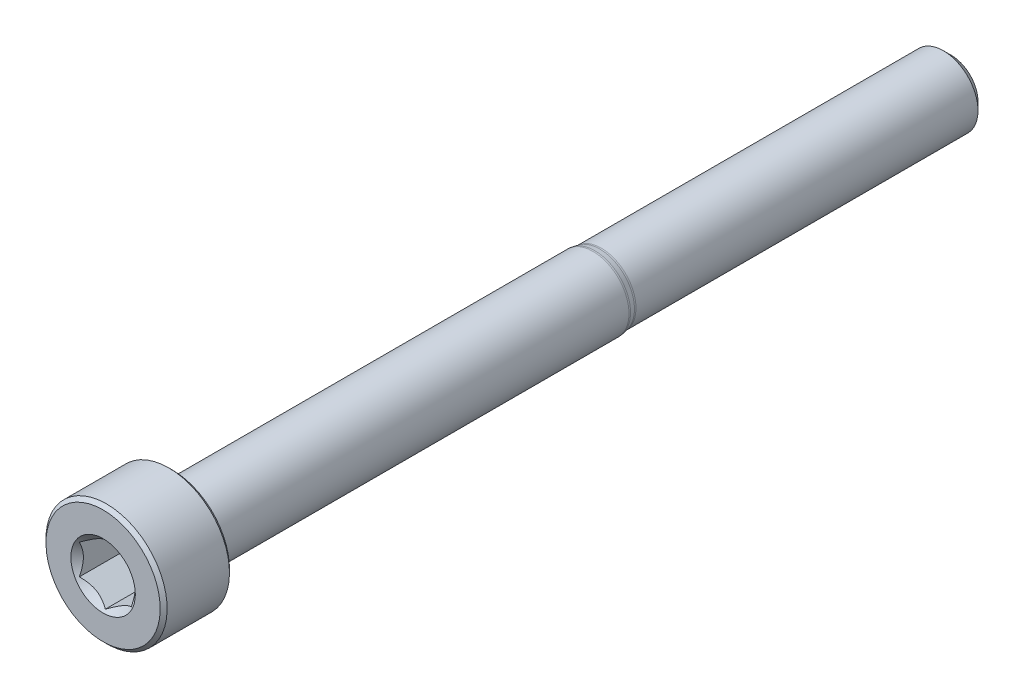
ISO-10303-21;
HEADER;
FILE_DESCRIPTION(('STEP AP214'),'2;1');
FILE_NAME('part.step','',(''),(''),'','','');
FILE_SCHEMA(('AUTOMOTIVE_DESIGN { 1 0 10303 214 1 1 1 1 }'));
ENDSEC;
DATA;
#1=APPLICATION_CONTEXT('core data for automotive mechanical design processes');
#2=APPLICATION_PROTOCOL_DEFINITION('international standard','automotive_design',2000,#1);
#3=PRODUCT_CONTEXT('',#1,'mechanical');
#4=PRODUCT('Part','Part','',(#3));
#5=PRODUCT_RELATED_PRODUCT_CATEGORY('part','',(#4));
#6=PRODUCT_DEFINITION_FORMATION('','',#4);
#7=PRODUCT_DEFINITION_CONTEXT('part definition',#1,'design');
#8=PRODUCT_DEFINITION('design','',#6,#7);
#9=PRODUCT_DEFINITION_SHAPE('','',#8);
#10=(LENGTH_UNIT() NAMED_UNIT(*) SI_UNIT(.MILLI.,.METRE.));
#11=(NAMED_UNIT(*) PLANE_ANGLE_UNIT() SI_UNIT($,.RADIAN.));
#12=(NAMED_UNIT(*) SI_UNIT($,.STERADIAN.) SOLID_ANGLE_UNIT());
#13=UNCERTAINTY_MEASURE_WITH_UNIT(LENGTH_MEASURE(1.E-05),#10,'distance_accuracy_value','');
#14=(GEOMETRIC_REPRESENTATION_CONTEXT(3) GLOBAL_UNCERTAINTY_ASSIGNED_CONTEXT((#13)) GLOBAL_UNIT_ASSIGNED_CONTEXT((#10,
#11,#12)) REPRESENTATION_CONTEXT('',''));
#15=CARTESIAN_POINT('',(0.,0.,0.));
#16=DIRECTION('',(0.,0.,1.));
#17=DIRECTION('',(1.,0.,0.));
#18=AXIS2_PLACEMENT_3D('',#15,#16,#17);
#19=CARTESIAN_POINT('',(0.,1.54533666301317,-24.5));
#20=DIRECTION('',(0.,0.,-1.));
#21=DIRECTION('',(0.,1.,0.));
#22=AXIS2_PLACEMENT_3D('',#19,#20,#21);
#23=PLANE('',#22);
#24=CARTESIAN_POINT('',(0.,0.,-24.5));
#25=DIRECTION('',(0.,0.,-1.));
#26=DIRECTION('',(0.,1.,0.));
#27=AXIS2_PLACEMENT_3D('',#24,#25,#26);
#28=CIRCLE('',#27,1.54533666301317);
#29=CARTESIAN_POINT('',(0.,1.54533666301317,-24.5));
#30=VERTEX_POINT('',#29);
#31=EDGE_CURVE('E49',#30,#30,#28,.T.);
#32=ORIENTED_EDGE('',*,*,#31,.T.);
#33=EDGE_LOOP('',(#32));
#34=FACE_BOUND('',#33,.T.);
#35=ADVANCED_FACE('F36',(#34),#23,.T.);
#36=CARTESIAN_POINT('',(0.,0.,-24.5));
#37=DIRECTION('',(0.,0.,1.));
#38=DIRECTION('',(0.,-1.,0.));
#39=AXIS2_PLACEMENT_3D('',#36,#37,#38);
#40=CONICAL_SURFACE('',#39,1.54533666301317,0.785398163397439);
#41=CARTESIAN_POINT('',(0.,0.,-24.0453366630132));
#42=DIRECTION('',(0.,0.,-1.));
#43=DIRECTION('',(0.,1.,0.));
#44=AXIS2_PLACEMENT_3D('',#41,#42,#43);
#45=CIRCLE('',#44,2.);
#46=CARTESIAN_POINT('',(0.,2.,-24.0453366630132));
#47=VERTEX_POINT('',#46);
#48=EDGE_CURVE('E164',#47,#47,#45,.T.);
#49=ORIENTED_EDGE('',*,*,#48,.T.);
#50=EDGE_LOOP('',(#49));
#51=FACE_BOUND('',#50,.T.);
#52=ORIENTED_EDGE('',*,*,#31,.F.);
#53=EDGE_LOOP('',(#52));
#54=FACE_BOUND('',#53,.T.);
#55=ADVANCED_FACE('F170',(#51,#54),#40,.T.);
#56=CARTESIAN_POINT('',(0.,0.,-24.5));
#57=DIRECTION('',(0.,0.,-1.));
#58=DIRECTION('',(0.,1.,0.));
#59=AXIS2_PLACEMENT_3D('',#56,#57,#58);
#60=CYLINDRICAL_SURFACE('',#59,2.);
#61=CARTESIAN_POINT('',(0.,0.,-4.28674570167858));
#62=DIRECTION('',(0.,0.,-1.));
#63=DIRECTION('',(0.,1.,0.));
#64=AXIS2_PLACEMENT_3D('',#61,#62,#63);
#65=CIRCLE('',#64,2.);
#66=CARTESIAN_POINT('',(0.,2.,-4.28674570167858));
#67=VERTEX_POINT('',#66);
#68=EDGE_CURVE('E161',#67,#67,#65,.T.);
#69=ORIENTED_EDGE('',*,*,#68,.T.);
#70=EDGE_LOOP('',(#69));
#71=FACE_BOUND('',#70,.T.);
#72=ORIENTED_EDGE('',*,*,#48,.F.);
#73=EDGE_LOOP('',(#72));
#74=FACE_BOUND('',#73,.T.);
#75=ADVANCED_FACE('F172',(#71,#74),#60,.T.);
#76=CARTESIAN_POINT('',(0.,0.,-4.28674570167858));
#77=DIRECTION('',(0.,0.,-1.));
#78=DIRECTION('',(0.,1.,0.));
#79=AXIS2_PLACEMENT_3D('',#76,#77,#78);
#80=TOROIDAL_SURFACE('',#79,2.5,0.5);
#81=CARTESIAN_POINT('',(0.,0.,-4.18920054067052));
#82=DIRECTION('',(0.,0.,-1.));
#83=DIRECTION('',(0.,1.,0.));
#84=AXIS2_PLACEMENT_3D('',#81,#82,#83);
#85=CIRCLE('',#84,2.00960735979838);
#86=CARTESIAN_POINT('',(0.,2.00960735979838,-4.18920054067052));
#87=VERTEX_POINT('',#86);
#88=EDGE_CURVE('E158',#87,#87,#85,.T.);
#89=ORIENTED_EDGE('',*,*,#88,.T.);
#90=EDGE_LOOP('',(#89));
#91=FACE_BOUND('',#90,.T.);
#92=ORIENTED_EDGE('',*,*,#68,.F.);
#93=EDGE_LOOP('',(#92));
#94=FACE_BOUND('',#93,.T.);
#95=ADVANCED_FACE('F178',(#91,#94),#80,.F.);
#96=CARTESIAN_POINT('',(0.,0.,-4.18920054067052));
#97=DIRECTION('',(0.,0.,1.));
#98=DIRECTION('',(0.,-1.,0.));
#99=AXIS2_PLACEMENT_3D('',#96,#97,#98);
#100=CONICAL_SURFACE('',#99,2.00960735979838,0.196349540849355);
#101=CARTESIAN_POINT('',(0.,0.,-3.90484163438686));
#102=DIRECTION('',(0.,0.,-1.));
#103=DIRECTION('',(0.,1.,0.));
#104=AXIS2_PLACEMENT_3D('',#101,#102,#103);
#105=CIRCLE('',#104,2.06616986303275);
#106=CARTESIAN_POINT('',(0.,2.06616986303275,-3.90484163438686));
#107=VERTEX_POINT('',#106);
#108=EDGE_CURVE('E155',#107,#107,#105,.T.);
#109=ORIENTED_EDGE('',*,*,#108,.T.);
#110=EDGE_LOOP('',(#109));
#111=FACE_BOUND('',#110,.T.);
#112=ORIENTED_EDGE('',*,*,#88,.F.);
#113=EDGE_LOOP('',(#112));
#114=FACE_BOUND('',#113,.T.);
#115=ADVANCED_FACE('F184',(#111,#114),#100,.T.);
#116=CARTESIAN_POINT('',(0.,0.,-3.8072964733788));
#117=DIRECTION('',(0.,0.,-1.));
#118=DIRECTION('',(0.,1.,0.));
#119=AXIS2_PLACEMENT_3D('',#116,#117,#118);
#120=TOROIDAL_SURFACE('',#119,1.57577722283114,0.5);
#121=CARTESIAN_POINT('',(0.,0.,-3.8072964733788));
#122=DIRECTION('',(0.,0.,-1.));
#123=DIRECTION('',(0.,1.,0.));
#124=AXIS2_PLACEMENT_3D('',#121,#122,#123);
#125=CIRCLE('',#124,2.07577722283114);
#126=CARTESIAN_POINT('',(0.,2.07577722283114,-3.8072964733788));
#127=VERTEX_POINT('',#126);
#128=EDGE_CURVE('E152',#127,#127,#125,.T.);
#129=ORIENTED_EDGE('',*,*,#128,.T.);
#130=EDGE_LOOP('',(#129));
#131=FACE_BOUND('',#130,.T.);
#132=ORIENTED_EDGE('',*,*,#108,.F.);
#133=EDGE_LOOP('',(#132));
#134=FACE_BOUND('',#133,.T.);
#135=ADVANCED_FACE('F188',(#131,#134),#120,.T.);
#136=CARTESIAN_POINT('',(0.,0.,-24.5));
#137=DIRECTION('',(0.,0.,-1.));
#138=DIRECTION('',(0.,1.,0.));
#139=AXIS2_PLACEMENT_3D('',#136,#137,#138);
#140=CYLINDRICAL_SURFACE('',#139,2.07577722283114);
#141=CARTESIAN_POINT('',(0.,0.,20.3));
#142=DIRECTION('',(0.,0.,-1.));
#143=DIRECTION('',(0.,1.,0.));
#144=AXIS2_PLACEMENT_3D('',#141,#142,#143);
#145=CIRCLE('',#144,2.07577722283114);
#146=CARTESIAN_POINT('',(0.,2.07577722283114,20.3));
#147=VERTEX_POINT('',#146);
#148=EDGE_CURVE('E149',#147,#147,#145,.T.);
#149=ORIENTED_EDGE('',*,*,#148,.T.);
#150=EDGE_LOOP('',(#149));
#151=FACE_BOUND('',#150,.T.);
#152=ORIENTED_EDGE('',*,*,#128,.F.);
#153=EDGE_LOOP('',(#152));
#154=FACE_BOUND('',#153,.T.);
#155=ADVANCED_FACE('F192',(#151,#154),#140,.T.);
#156=CARTESIAN_POINT('',(0.,0.,20.3));
#157=DIRECTION('',(0.,0.,-1.));
#158=DIRECTION('',(0.,1.,0.));
#159=AXIS2_PLACEMENT_3D('',#156,#157,#158);
#160=TOROIDAL_SURFACE('',#159,2.27577722283114,0.2);
#161=CARTESIAN_POINT('',(0.,0.,20.5));
#162=DIRECTION('',(0.,0.,-1.));
#163=DIRECTION('',(0.,1.,0.));
#164=AXIS2_PLACEMENT_3D('',#161,#162,#163);
#165=CIRCLE('',#164,2.27577722283114);
#166=CARTESIAN_POINT('',(0.,2.27577722283114,20.5));
#167=VERTEX_POINT('',#166);
#168=EDGE_CURVE('E146',#167,#167,#165,.T.);
#169=ORIENTED_EDGE('',*,*,#168,.T.);
#170=EDGE_LOOP('',(#169));
#171=FACE_BOUND('',#170,.T.);
#172=ORIENTED_EDGE('',*,*,#148,.F.);
#173=EDGE_LOOP('',(#172));
#174=FACE_BOUND('',#173,.T.);
#175=ADVANCED_FACE('F196',(#171,#174),#160,.F.);
#176=CARTESIAN_POINT('',(0.,3.3,20.5));
#177=DIRECTION('',(0.,0.,-1.));
#178=DIRECTION('',(0.,1.,0.));
#179=AXIS2_PLACEMENT_3D('',#176,#177,#178);
#180=PLANE('',#179);
#181=CARTESIAN_POINT('',(0.,0.,20.5));
#182=DIRECTION('',(0.,0.,-1.));
#183=DIRECTION('',(0.,1.,0.));
#184=AXIS2_PLACEMENT_3D('',#181,#182,#183);
#185=CIRCLE('',#184,3.3);
#186=CARTESIAN_POINT('',(0.,3.3,20.5));
#187=VERTEX_POINT('',#186);
#188=EDGE_CURVE('E143',#187,#187,#185,.T.);
#189=ORIENTED_EDGE('',*,*,#188,.T.);
#190=EDGE_LOOP('',(#189));
#191=FACE_BOUND('',#190,.T.);
#192=ORIENTED_EDGE('',*,*,#168,.F.);
#193=EDGE_LOOP('',(#192));
#194=FACE_BOUND('',#193,.T.);
#195=ADVANCED_FACE('F200',(#191,#194),#180,.T.);
#196=CARTESIAN_POINT('',(0.,0.,20.5));
#197=DIRECTION('',(0.,0.,1.));
#198=DIRECTION('',(0.,-1.,0.));
#199=AXIS2_PLACEMENT_3D('',#196,#197,#198);
#200=CONICAL_SURFACE('',#199,3.3,0.785398163397452);
#201=CARTESIAN_POINT('',(0.,0.,20.7));
#202=DIRECTION('',(0.,0.,-1.));
#203=DIRECTION('',(0.,1.,0.));
#204=AXIS2_PLACEMENT_3D('',#201,#202,#203);
#205=CIRCLE('',#204,3.5);
#206=CARTESIAN_POINT('',(0.,3.5,20.7));
#207=VERTEX_POINT('',#206);
#208=EDGE_CURVE('E140',#207,#207,#205,.T.);
#209=ORIENTED_EDGE('',*,*,#208,.T.);
#210=EDGE_LOOP('',(#209));
#211=FACE_BOUND('',#210,.T.);
#212=ORIENTED_EDGE('',*,*,#188,.F.);
#213=EDGE_LOOP('',(#212));
#214=FACE_BOUND('',#213,.T.);
#215=ADVANCED_FACE('F204',(#211,#214),#200,.T.);
#216=CARTESIAN_POINT('',(0.,0.,-24.5));
#217=DIRECTION('',(0.,0.,-1.));
#218=DIRECTION('',(0.,1.,0.));
#219=AXIS2_PLACEMENT_3D('',#216,#217,#218);
#220=CYLINDRICAL_SURFACE('',#219,3.5);
#221=CARTESIAN_POINT('',(0.,0.,24.3));
#222=DIRECTION('',(0.,0.,-1.));
#223=DIRECTION('',(0.,1.,0.));
#224=AXIS2_PLACEMENT_3D('',#221,#222,#223);
#225=CIRCLE('',#224,3.5);
#226=CARTESIAN_POINT('',(0.,3.5,24.3));
#227=VERTEX_POINT('',#226);
#228=EDGE_CURVE('E137',#227,#227,#225,.T.);
#229=ORIENTED_EDGE('',*,*,#228,.T.);
#230=EDGE_LOOP('',(#229));
#231=FACE_BOUND('',#230,.T.);
#232=ORIENTED_EDGE('',*,*,#208,.F.);
#233=EDGE_LOOP('',(#232));
#234=FACE_BOUND('',#233,.T.);
#235=ADVANCED_FACE('F208',(#231,#234),#220,.T.);
#236=CARTESIAN_POINT('',(0.,0.,24.3));
#237=DIRECTION('',(0.,0.,-1.));
#238=DIRECTION('',(0.,1.,0.));
#239=AXIS2_PLACEMENT_3D('',#236,#237,#238);
#240=CONICAL_SURFACE('',#239,3.5,0.785398163397452);
#241=CARTESIAN_POINT('',(0.,0.,24.5));
#242=DIRECTION('',(0.,0.,-1.));
#243=DIRECTION('',(0.,1.,0.));
#244=AXIS2_PLACEMENT_3D('',#241,#242,#243);
#245=CIRCLE('',#244,3.3);
#246=CARTESIAN_POINT('',(0.,3.3,24.5));
#247=VERTEX_POINT('',#246);
#248=EDGE_CURVE('E134',#247,#247,#245,.T.);
#249=ORIENTED_EDGE('',*,*,#248,.T.);
#250=EDGE_LOOP('',(#249));
#251=FACE_BOUND('',#250,.T.);
#252=ORIENTED_EDGE('',*,*,#228,.F.);
#253=EDGE_LOOP('',(#252));
#254=FACE_BOUND('',#253,.T.);
#255=ADVANCED_FACE('F212',(#251,#254),#240,.T.);
#256=CARTESIAN_POINT('',(0.,0.,24.5));
#257=DIRECTION('',(0.,0.,1.));
#258=DIRECTION('',(0.,-1.,0.));
#259=AXIS2_PLACEMENT_3D('',#256,#257,#258);
#260=PLANE('',#259);
#261=CARTESIAN_POINT('',(0.,0.,24.5));
#262=DIRECTION('',(0.,0.,1.));
#263=DIRECTION('',(1.,0.,0.));
#264=AXIS2_PLACEMENT_3D('',#261,#262,#263);
#265=CIRCLE('',#264,1.86195461813654);
#266=CARTESIAN_POINT('',(1.86195461813654,0.,24.5));
#267=VERTEX_POINT('',#266);
#268=EDGE_CURVE('E108',#267,#267,#265,.T.);
#269=ORIENTED_EDGE('',*,*,#268,.F.);
#270=EDGE_LOOP('',(#269));
#271=FACE_BOUND('',#270,.T.);
#272=ORIENTED_EDGE('',*,*,#248,.F.);
#273=EDGE_LOOP('',(#272));
#274=FACE_BOUND('',#273,.T.);
#275=ADVANCED_FACE('F216',(#271,#274),#260,.T.);
#276=CARTESIAN_POINT('',(0.,0.,24.5));
#277=DIRECTION('',(0.,0.,1.));
#278=DIRECTION('',(1.,0.,0.));
#279=AXIS2_PLACEMENT_3D('',#276,#277,#278);
#280=CONICAL_SURFACE('',#279,1.86195461813654,0.78539816339745);
#281=ORIENTED_EDGE('',*,*,#268,.T.);
#282=EDGE_LOOP('',(#281));
#283=FACE_BOUND('',#282,.T.);
#284=CARTESIAN_POINT('',(-0.000199999999999613,-1.73216627762272,24.3702116710324));
#285=CARTESIAN_POINT('',(0.051367790737076,-1.70239359975915,24.3404616654997));
#286=CARTESIAN_POINT('',(0.103797917665201,-1.67212305186355,24.3124586733426));
#287=CARTESIAN_POINT('',(0.210709034055597,-1.61039789003619,24.2611854198725));
#288=CARTESIAN_POINT('',(0.265200195814662,-1.57893740312614,24.2379436944767));
#289=CARTESIAN_POINT('',(0.37507908135725,-1.51549879897987,24.1981299184246));
#290=CARTESIAN_POINT('',(0.430438809095201,-1.4835368452681,24.1814577751032));
#291=CARTESIAN_POINT('',(0.542377257477151,-1.41890915196211,24.1557706462504));
#292=CARTESIAN_POINT('',(0.598952556553009,-1.38624538781118,24.1467364799112));
#293=CARTESIAN_POINT('',(0.696455389516442,-1.32995210095299,24.1385852706592));
#294=CARTESIAN_POINT('',(0.737256908280467,-1.30639533311124,24.1373784424216));
#295=CARTESIAN_POINT('',(0.818787969615859,-1.25932335290193,24.1394102465946));
#296=CARTESIAN_POINT('',(0.859517494314631,-1.23580815085313,24.1426498601806));
#297=CARTESIAN_POINT('',(0.940584402163417,-1.18900414978426,24.1533881754143));
#298=CARTESIAN_POINT('',(0.980921384598289,-1.16571558211719,24.1608908424511));
#299=CARTESIAN_POINT('',(1.06091833691403,-1.11952932016335,24.1797478013606));
#300=CARTESIAN_POINT('',(1.10057800851621,-1.09663179808786,24.1911037464509));
#301=CARTESIAN_POINT('',(1.20216313477449,-1.03798159809698,24.224817837025));
#302=CARTESIAN_POINT('',(1.26345855370969,-1.00259267147465,24.2497180385257));
#303=CARTESIAN_POINT('',(1.35358562846331,-0.950557780604375,24.2917528427039));
#304=CARTESIAN_POINT('',(1.38328513990772,-0.933410759677148,24.3065213429914));
#305=CARTESIAN_POINT('',(1.44213790138375,-0.899432101996407,24.3374067553725));
#306=CARTESIAN_POINT('',(1.47129140422064,-0.88260031928571,24.353523023554));
#307=CARTESIAN_POINT('',(1.5002,-0.8659099337306,24.3702116710324));
#308=B_SPLINE_CURVE_WITH_KNOTS('',3,(#284,#285,#286,#287,#288,#289,#290,#291,#292,#293,#294,
#295,#296,#297,#298,#299,#300,#301,#302,#303,#304,#305,#306,#307),.UNSPECIFIED.,.F.,.F.,(4,2,2,
2,2,2,2,2,2,2,2,4),(0.,0.199829143693306,0.40082298738239,0.598623720538182,0.79592624018889,
0.937113067959882,1.07833105577193,1.21968061668222,1.36109089931055,1.58570969637565,
1.69770705470963,1.80965120737194),.UNSPECIFIED.);
#309=CARTESIAN_POINT('',(0.,-1.73205080756888,24.3700961894323));
#310=VERTEX_POINT('',#309);
#311=CARTESIAN_POINT('',(1.5,-0.866025403784438,24.3700961894323));
#312=VERTEX_POINT('',#311);
#313=EDGE_CURVE('E12',#310,#312,#308,.T.);
#314=ORIENTED_EDGE('',*,*,#313,.F.);
#315=CARTESIAN_POINT('',(-1.5002,-0.865909933730601,24.3702116710324));
#316=CARTESIAN_POINT('',(-1.44863220926292,-0.895682611594166,24.3404616654997));
#317=CARTESIAN_POINT('',(-1.3962020823348,-0.925953159489766,24.3124586733426));
#318=CARTESIAN_POINT('',(-1.2892909659444,-0.987678321317124,24.2611854198725));
#319=CARTESIAN_POINT('',(-1.23479980418534,-1.01913880822718,24.2379436944767));
#320=CARTESIAN_POINT('',(-1.12492091864275,-1.08257741237344,24.1981299184246));
#321=CARTESIAN_POINT('',(-1.0695611909048,-1.11453936608521,24.1814577751032));
#322=CARTESIAN_POINT('',(-0.957622742522848,-1.1791670593912,24.1557706462504));
#323=CARTESIAN_POINT('',(-0.90104744344699,-1.21183082354213,24.1467364799112));
#324=CARTESIAN_POINT('',(-0.803544610483558,-1.26812411040032,24.1385852706592));
#325=CARTESIAN_POINT('',(-0.762743091719533,-1.29168087824208,24.1373784424216));
#326=CARTESIAN_POINT('',(-0.681212030384141,-1.33875285845138,24.1394102465946));
#327=CARTESIAN_POINT('',(-0.640482505685369,-1.36226806050018,24.1426498601806));
#328=CARTESIAN_POINT('',(-0.559415597836583,-1.40907206156905,24.1533881754143));
#329=CARTESIAN_POINT('',(-0.519078615401711,-1.43236062923612,24.1608908424511));
#330=CARTESIAN_POINT('',(-0.439081663085968,-1.47854689118997,24.1797478013606));
#331=CARTESIAN_POINT('',(-0.399421991483791,-1.50144441326545,24.1911037464509));
#332=CARTESIAN_POINT('',(-0.297836865225514,-1.56009461325633,24.224817837025));
#333=CARTESIAN_POINT('',(-0.23654144629031,-1.59548353987866,24.2497180385257));
#334=CARTESIAN_POINT('',(-0.146414371536686,-1.64751843074894,24.2917528427039));
#335=CARTESIAN_POINT('',(-0.116714860092282,-1.66466545167617,24.3065213429914));
#336=CARTESIAN_POINT('',(-0.057862098616249,-1.69864410935691,24.3374067553725));
#337=CARTESIAN_POINT('',(-0.0287085957793625,-1.71547589206761,24.353523023554));
#338=CARTESIAN_POINT('',(0.000200000000000539,-1.73216627762272,24.3702116710324));
#339=B_SPLINE_CURVE_WITH_KNOTS('',3,(#315,#316,#317,#318,#319,#320,#321,#322,#323,#324,#325,
#326,#327,#328,#329,#330,#331,#332,#333,#334,#335,#336,#337,#338),.UNSPECIFIED.,.F.,.F.,(4,2,2,
2,2,2,2,2,2,2,2,4),(0.,0.199829143693306,0.40082298738239,0.598623720538182,0.795926240188891,
0.937113067959882,1.07833105577193,1.21968061668222,1.36109089931055,1.58570969637566,
1.69770705470964,1.80965120737194),.UNSPECIFIED.);
#340=CARTESIAN_POINT('',(-1.5,-0.866025403784439,24.3700961894323));
#341=VERTEX_POINT('',#340);
#342=EDGE_CURVE('E94',#341,#310,#339,.T.);
#343=ORIENTED_EDGE('',*,*,#342,.F.);
#344=CARTESIAN_POINT('',(-1.5,-1.81798644339826,24.9949659805218));
#345=CARTESIAN_POINT('',(-1.5,-1.7741049212163,24.9611234480288));
#346=CARTESIAN_POINT('',(-1.5,-1.7299890896826,24.927585707746));
#347=CARTESIAN_POINT('',(-1.5,-1.64119040614349,24.8612482560218));
#348=CARTESIAN_POINT('',(-1.5,-1.59650742345673,24.8284487196869));
#349=CARTESIAN_POINT('',(-1.5,-1.46080703724549,24.7308819989223));
#350=CARTESIAN_POINT('',(-1.5,-1.36880260139859,24.6674654805716));
#351=CARTESIAN_POINT('',(-1.5,-1.17526244907484,24.5421024160959));
#352=CARTESIAN_POINT('',(-1.5,-1.07349399309978,24.4805114517827));
#353=CARTESIAN_POINT('',(-1.5,-0.864764886493364,24.367252227632));
#354=CARTESIAN_POINT('',(-1.5,-0.757823368449898,24.3155504543104));
#355=CARTESIAN_POINT('',(-1.5,-0.598146096468989,24.2522731835563));
#356=CARTESIAN_POINT('',(-1.5,-0.547969975291046,24.2342740943257));
#357=CARTESIAN_POINT('',(-1.5,-0.446326905726014,24.2022954757007));
#358=CARTESIAN_POINT('',(-1.5,-0.39485987612543,24.1883161998935));
#359=CARTESIAN_POINT('',(-1.5,-0.291848443786788,24.1653656993307));
#360=CARTESIAN_POINT('',(-1.5,-0.240324799163318,24.1563028233891));
#361=CARTESIAN_POINT('',(-1.5,-0.136625504447977,24.1433771204074));
#362=CARTESIAN_POINT('',(-1.5,-0.0844499953262876,24.1395131880538));
#363=CARTESIAN_POINT('',(-1.5,0.017680632277305,24.1373196118873));
#364=CARTESIAN_POINT('',(-1.5,0.0676306379007709,24.1387500662965));
#365=CARTESIAN_POINT('',(-1.5,0.167145406902043,24.1465133064628));
#366=CARTESIAN_POINT('',(-1.5,0.216710135235096,24.1528465330246));
#367=CARTESIAN_POINT('',(-1.5,0.315937074154246,24.1701627013475));
#368=CARTESIAN_POINT('',(-1.5,0.365584655317233,24.181228133276));
#369=CARTESIAN_POINT('',(-1.5,0.463781524266198,24.2073934750171));
#370=CARTESIAN_POINT('',(-1.5,0.512330870231959,24.2224931705662));
#371=CARTESIAN_POINT('',(-1.5,0.661312921957409,24.2746138155249));
#372=CARTESIAN_POINT('',(-1.5,0.759720673218968,24.3174049108191));
#373=CARTESIAN_POINT('',(-1.5,0.951942523388261,24.4126387595345));
#374=CARTESIAN_POINT('',(-1.5,1.0457389623009,24.465115435405));
#375=CARTESIAN_POINT('',(-1.5,1.22504135106297,24.573478220585));
#376=CARTESIAN_POINT('',(-1.5,1.31072808141301,24.6290689766907));
#377=CARTESIAN_POINT('',(-1.5,1.43696938793222,24.7150503092413));
#378=CARTESIAN_POINT('',(-1.5,1.47850703658459,24.7440225300034));
#379=CARTESIAN_POINT('',(-1.5,1.56101227498314,24.8027447189929));
#380=CARTESIAN_POINT('',(-1.5,1.60198001874048,24.8324944705885));
#381=CARTESIAN_POINT('',(-1.5,1.64271005760726,24.862566978379));
#382=B_SPLINE_CURVE_WITH_KNOTS('',3,(#344,#345,#346,#347,#348,#349,#350,#351,#352,#353,#354,
#355,#356,#357,#358,#359,#360,#361,#362,#363,#364,#365,#366,#367,#368,#369,#370,#371,#372,#373,
#374,#375,#376,#377,#378,#379,#380,#381),.UNSPECIFIED.,.F.,.F.,(4,2,2,2,2,2,2,2,2,2,2,2,2,2,2,2,
2,2,4),(0.,0.16624326595874,0.332525558867044,0.667617646006965,1.02421670216266,
1.37958499445802,1.53937198099665,1.69916904537709,1.85587476796104,2.01254716909175,
2.16220908021825,2.3118844489035,2.4642826618586,2.61667278241372,2.93766302990029,
3.25979960403481,3.56606520142079,3.71798977734031,3.8698724667598),.UNSPECIFIED.);
#383=CARTESIAN_POINT('',(-1.5,0.866025403784438,24.3700961894323));
#384=VERTEX_POINT('',#383);
#385=EDGE_CURVE('E107',#384,#341,#382,.F.);
#386=ORIENTED_EDGE('',*,*,#385,.F.);
#387=CARTESIAN_POINT('',(0.000199999999999576,1.73216627762272,24.3702116710324));
#388=CARTESIAN_POINT('',(-0.051367790737076,1.70239359975915,24.3404616654997));
#389=CARTESIAN_POINT('',(-0.103797917665201,1.67212305186355,24.3124586733426));
#390=CARTESIAN_POINT('',(-0.210709034055597,1.61039789003619,24.2611854198725));
#391=CARTESIAN_POINT('',(-0.265200195814662,1.57893740312614,24.2379436944767));
#392=CARTESIAN_POINT('',(-0.37507908135725,1.51549879897987,24.1981299184246));
#393=CARTESIAN_POINT('',(-0.4304388090952,1.4835368452681,24.1814577751032));
#394=CARTESIAN_POINT('',(-0.542377257477151,1.41890915196211,24.1557706462504));
#395=CARTESIAN_POINT('',(-0.598952556553009,1.38624538781118,24.1467364799112));
#396=CARTESIAN_POINT('',(-0.696455389516441,1.32995210095299,24.1385852706592));
#397=CARTESIAN_POINT('',(-0.737256908280467,1.30639533311124,24.1373784424216));
#398=CARTESIAN_POINT('',(-0.818787969615859,1.25932335290193,24.1394102465946));
#399=CARTESIAN_POINT('',(-0.859517494314631,1.23580815085313,24.1426498601806));
#400=CARTESIAN_POINT('',(-0.940584402163417,1.18900414978427,24.1533881754143));
#401=CARTESIAN_POINT('',(-0.980921384598289,1.16571558211719,24.1608908424511));
#402=CARTESIAN_POINT('',(-1.06091833691403,1.11952932016335,24.1797478013606));
#403=CARTESIAN_POINT('',(-1.10057800851621,1.09663179808786,24.1911037464509));
#404=CARTESIAN_POINT('',(-1.20216313477449,1.03798159809698,24.224817837025));
#405=CARTESIAN_POINT('',(-1.26345855370969,1.00259267147465,24.2497180385257));
#406=CARTESIAN_POINT('',(-1.35358562846331,0.950557780604375,24.2917528427039));
#407=CARTESIAN_POINT('',(-1.38328513990772,0.933410759677148,24.3065213429914));
#408=CARTESIAN_POINT('',(-1.44213790138375,0.899432101996407,24.3374067553725));
#409=CARTESIAN_POINT('',(-1.47129140422064,0.88260031928571,24.353523023554));
#410=CARTESIAN_POINT('',(-1.5002,0.865909933730601,24.3702116710324));
#411=B_SPLINE_CURVE_WITH_KNOTS('',3,(#387,#388,#389,#390,#391,#392,#393,#394,#395,#396,#397,
#398,#399,#400,#401,#402,#403,#404,#405,#406,#407,#408,#409,#410),.UNSPECIFIED.,.F.,.F.,(4,2,2,
2,2,2,2,2,2,2,2,4),(0.,0.199829143693306,0.40082298738239,0.598623720538182,0.79592624018889,
0.937113067959882,1.07833105577193,1.21968061668222,1.36109089931055,1.58570969637565,
1.69770705470963,1.80965120737194),.UNSPECIFIED.);
#412=CARTESIAN_POINT('',(0.,1.73205080756888,24.3700961894323));
#413=VERTEX_POINT('',#412);
#414=EDGE_CURVE('E266',#413,#384,#411,.T.);
#415=ORIENTED_EDGE('',*,*,#414,.F.);
#416=CARTESIAN_POINT('',(1.5002,0.865909933730601,24.3702116710324));
#417=CARTESIAN_POINT('',(1.44863220926292,0.895682611594166,24.3404616654997));
#418=CARTESIAN_POINT('',(1.3962020823348,0.925953159489765,24.3124586733426));
#419=CARTESIAN_POINT('',(1.2892909659444,0.987678321317124,24.2611854198725));
#420=CARTESIAN_POINT('',(1.23479980418534,1.01913880822718,24.2379436944767));
#421=CARTESIAN_POINT('',(1.12492091864275,1.08257741237344,24.1981299184246));
#422=CARTESIAN_POINT('',(1.0695611909048,1.11453936608521,24.1814577751032));
#423=CARTESIAN_POINT('',(0.957622742522848,1.1791670593912,24.1557706462504));
#424=CARTESIAN_POINT('',(0.90104744344699,1.21183082354213,24.1467364799112));
#425=CARTESIAN_POINT('',(0.803544610483558,1.26812411040032,24.1385852706592));
#426=CARTESIAN_POINT('',(0.762743091719532,1.29168087824208,24.1373784424216));
#427=CARTESIAN_POINT('',(0.68121203038414,1.33875285845138,24.1394102465946));
#428=CARTESIAN_POINT('',(0.640482505685369,1.36226806050018,24.1426498601806));
#429=CARTESIAN_POINT('',(0.559415597836582,1.40907206156905,24.1533881754143));
#430=CARTESIAN_POINT('',(0.51907861540171,1.43236062923612,24.1608908424511));
#431=CARTESIAN_POINT('',(0.439081663085968,1.47854689118997,24.1797478013606));
#432=CARTESIAN_POINT('',(0.39942199148379,1.50144441326545,24.1911037464509));
#433=CARTESIAN_POINT('',(0.297836865225514,1.56009461325633,24.224817837025));
#434=CARTESIAN_POINT('',(0.23654144629031,1.59548353987866,24.2497180385257));
#435=CARTESIAN_POINT('',(0.146414371536686,1.64751843074894,24.2917528427039));
#436=CARTESIAN_POINT('',(0.116714860092282,1.66466545167617,24.3065213429914));
#437=CARTESIAN_POINT('',(0.0578620986162493,1.69864410935691,24.3374067553725));
#438=CARTESIAN_POINT('',(0.028708595779363,1.71547589206761,24.353523023554));
#439=CARTESIAN_POINT('',(-0.0001999999999999,1.73216627762271,24.3702116710324));
#440=B_SPLINE_CURVE_WITH_KNOTS('',3,(#416,#417,#418,#419,#420,#421,#422,#423,#424,#425,#426,
#427,#428,#429,#430,#431,#432,#433,#434,#435,#436,#437,#438,#439),.UNSPECIFIED.,.F.,.F.,(4,2,2,
2,2,2,2,2,2,2,2,4),(0.,0.199829143693306,0.40082298738239,0.598623720538183,0.795926240188891,
0.937113067959883,1.07833105577193,1.21968061668222,1.36109089931055,1.58570969637566,
1.69770705470964,1.80965120737194),.UNSPECIFIED.);
#441=CARTESIAN_POINT('',(1.5,0.866025403784439,24.3700961894323));
#442=VERTEX_POINT('',#441);
#443=EDGE_CURVE('E239',#442,#413,#440,.T.);
#444=ORIENTED_EDGE('',*,*,#443,.F.);
#445=CARTESIAN_POINT('',(1.5,-1.81798631684901,24.9949658829093));
#446=CARTESIAN_POINT('',(1.5,-1.77410479833239,24.961123354197));
#447=CARTESIAN_POINT('',(1.5,-1.72998897047494,24.927585617689));
#448=CARTESIAN_POINT('',(1.5,-1.64119029432319,24.8612481734927));
#449=CARTESIAN_POINT('',(1.5,-1.59650731534755,24.828448640911));
#450=CARTESIAN_POINT('',(1.5,-1.460806940489,24.7308819314804));
#451=CARTESIAN_POINT('',(1.5,-1.36880251235632,24.6674654206559));
#452=CARTESIAN_POINT('',(1.5,-1.17526237686872,24.5421023717216));
#453=CARTESIAN_POINT('',(1.5,-1.07349393006072,24.4805114153672));
#454=CARTESIAN_POINT('',(1.5,-0.86476484256063,24.3672522059965));
#455=CARTESIAN_POINT('',(1.5,-0.75782333444995,24.3155504395058));
#456=CARTESIAN_POINT('',(1.5,-0.598146069886857,24.2522731736164));
#457=CARTESIAN_POINT('',(1.5,-0.547969945491555,24.2342740839912));
#458=CARTESIAN_POINT('',(1.5,-0.446326869364772,24.2022954652208));
#459=CARTESIAN_POINT('',(1.5,-0.394859836419922,24.1883161896624));
#460=CARTESIAN_POINT('',(1.5,-0.291848397493322,24.1653656903726));
#461=CARTESIAN_POINT('',(1.5,-0.240324749628768,24.1563028154328));
#462=CARTESIAN_POINT('',(1.5,-0.136625448515907,24.1433771152152));
#463=CARTESIAN_POINT('',(1.5,-0.0844499362377768,24.1395131846234));
#464=CARTESIAN_POINT('',(1.5,0.0176806967011162,24.1373196125689));
#465=CARTESIAN_POINT('',(1.5,0.0676307045116647,24.1387500692366));
#466=CARTESIAN_POINT('',(1.5,0.167145477637763,24.1465133142386));
#467=CARTESIAN_POINT('',(1.5,0.216710207908516,24.1528465433779));
#468=CARTESIAN_POINT('',(1.5,0.315937150651984,24.1701627170715));
#469=CARTESIAN_POINT('',(1.5,0.36558473369454,24.1812281518103));
#470=CARTESIAN_POINT('',(1.5,0.463781606198771,24.2073934991991));
#471=CARTESIAN_POINT('',(1.5,0.51233095384026,24.2224931975855));
#472=CARTESIAN_POINT('',(1.5,0.661313023287692,24.2746138556917));
#473=CARTESIAN_POINT('',(1.5,0.759720789706279,24.3174049630424));
#474=CARTESIAN_POINT('',(1.5,0.951942669022773,24.4126388372101));
#475=CARTESIAN_POINT('',(1.5,1.04573912191845,24.465115526486));
#476=CARTESIAN_POINT('',(1.5,1.22504153577549,24.5734783373155));
#477=CARTESIAN_POINT('',(1.5,1.3107282773288,24.6290691055441));
#478=CARTESIAN_POINT('',(1.5,1.43696960041028,24.7150504562164));
#479=CARTESIAN_POINT('',(1.5,1.47850725450333,24.7440226829709));
#480=CARTESIAN_POINT('',(1.5,1.56101250374723,24.8027448839378));
#481=CARTESIAN_POINT('',(1.5,1.60198025290925,24.8324946415183));
#482=CARTESIAN_POINT('',(1.5,1.64271029717086,24.862567155286));
#483=B_SPLINE_CURVE_WITH_KNOTS('',3,(#445,#446,#447,#448,#449,#450,#451,#452,#453,#454,#455,
#456,#457,#458,#459,#460,#461,#462,#463,#464,#465,#466,#467,#468,#469,#470,#471,#472,#473,#474,
#475,#476,#477,#478,#479,#480,#481,#482),.UNSPECIFIED.,.F.,.F.,(4,2,2,2,2,2,2,2,2,2,2,2,2,2,2,2,
2,2,4),(0.,0.166243250325253,0.332525527595492,0.667617582874062,1.02421660314856,
1.37958485991001,1.53937185590113,1.69916892971772,1.85587466130012,2.01254707142443,
2.16220898927398,2.31188436469119,2.46428258498153,2.61667271286895,2.93766301623296,
3.25979964661299,3.56606529199603,3.71798989158865,3.86987260467919),.UNSPECIFIED.);
#484=EDGE_CURVE('E56',#312,#442,#483,.T.);
#485=ORIENTED_EDGE('',*,*,#484,.F.);
#486=EDGE_LOOP('',(#314,#343,#386,#415,#444,#485));
#487=FACE_BOUND('',#486,.T.);
#488=ADVANCED_FACE('F93',(#283,#487),#280,.F.);
#489=CARTESIAN_POINT('',(0.,3.3,21.5));
#490=DIRECTION('',(0.,0.,-1.));
#491=DIRECTION('',(0.,1.,0.));
#492=AXIS2_PLACEMENT_3D('',#489,#490,#491);
#493=PLANE('',#492);
#494=DIRECTION('',(0.866025403784438,0.5,0.));
#495=VECTOR('',#494,1.);
#496=CARTESIAN_POINT('',(0.,-1.73205080756888,21.5));
#497=LINE('',#496,#495);
#498=CARTESIAN_POINT('',(0.,-1.73205080756888,21.5));
#499=VERTEX_POINT('',#498);
#500=CARTESIAN_POINT('',(1.5,-0.866025403784438,21.5));
#501=VERTEX_POINT('',#500);
#502=EDGE_CURVE('E111',#499,#501,#497,.T.);
#503=ORIENTED_EDGE('',*,*,#502,.T.);
#504=DIRECTION('',(0.,1.,0.));
#505=VECTOR('',#504,1.);
#506=CARTESIAN_POINT('',(1.5,-0.866025403784438,21.5));
#507=LINE('',#506,#505);
#508=CARTESIAN_POINT('',(1.5,0.866025403784439,21.5));
#509=VERTEX_POINT('',#508);
#510=EDGE_CURVE('E63',#501,#509,#507,.T.);
#511=ORIENTED_EDGE('',*,*,#510,.T.);
#512=DIRECTION('',(-0.866025403784439,0.5,0.));
#513=VECTOR('',#512,1.);
#514=CARTESIAN_POINT('',(1.5,0.866025403784439,21.5));
#515=LINE('',#514,#513);
#516=CARTESIAN_POINT('',(0.,1.73205080756888,21.5));
#517=VERTEX_POINT('',#516);
#518=EDGE_CURVE('E119',#509,#517,#515,.T.);
#519=ORIENTED_EDGE('',*,*,#518,.T.);
#520=DIRECTION('',(-0.866025403784439,-0.5,0.));
#521=VECTOR('',#520,1.);
#522=CARTESIAN_POINT('',(0.,1.73205080756888,21.5));
#523=LINE('',#522,#521);
#524=CARTESIAN_POINT('',(-1.5,0.866025403784438,21.5));
#525=VERTEX_POINT('',#524);
#526=EDGE_CURVE('E126',#517,#525,#523,.T.);
#527=ORIENTED_EDGE('',*,*,#526,.T.);
#528=DIRECTION('',(0.,-1.,0.));
#529=VECTOR('',#528,1.);
#530=CARTESIAN_POINT('',(-1.5,0.866025403784438,21.5));
#531=LINE('',#530,#529);
#532=CARTESIAN_POINT('',(-1.5,-0.866025403784439,21.5));
#533=VERTEX_POINT('',#532);
#534=EDGE_CURVE('E122',#525,#533,#531,.T.);
#535=ORIENTED_EDGE('',*,*,#534,.T.);
#536=DIRECTION('',(0.866025403784439,-0.5,0.));
#537=VECTOR('',#536,1.);
#538=CARTESIAN_POINT('',(-1.5,-0.866025403784439,21.5));
#539=LINE('',#538,#537);
#540=EDGE_CURVE('E112',#533,#499,#539,.T.);
#541=ORIENTED_EDGE('',*,*,#540,.T.);
#542=EDGE_LOOP('',(#503,#511,#519,#527,#535,#541));
#543=FACE_BOUND('',#542,.T.);
#544=ADVANCED_FACE('F221',(#543),#493,.F.);
#545=CARTESIAN_POINT('',(0.,-1.73205080756888,15.9174243050442));
#546=DIRECTION('',(0.5,-0.866025403784438,0.));
#547=DIRECTION('',(0.866025403784438,0.5,0.));
#548=AXIS2_PLACEMENT_3D('',#545,#546,#547);
#549=PLANE('',#548);
#550=DIRECTION('',(0.,0.,1.));
#551=VECTOR('',#550,1.);
#552=CARTESIAN_POINT('',(0.,-1.73205080756888,15.9174243050442));
#553=LINE('',#552,#551);
#554=EDGE_CURVE('E103',#499,#310,#553,.T.);
#555=ORIENTED_EDGE('',*,*,#554,.T.);
#556=ORIENTED_EDGE('',*,*,#313,.T.);
#557=DIRECTION('',(0.,0.,1.));
#558=VECTOR('',#557,1.);
#559=CARTESIAN_POINT('',(1.5,-0.866025403784438,15.9174243050442));
#560=LINE('',#559,#558);
#561=EDGE_CURVE('E114',#501,#312,#560,.T.);
#562=ORIENTED_EDGE('',*,*,#561,.F.);
#563=ORIENTED_EDGE('',*,*,#502,.F.);
#564=EDGE_LOOP('',(#555,#556,#562,#563));
#565=FACE_BOUND('',#564,.T.);
#566=ADVANCED_FACE('F110',(#565),#549,.F.);
#567=CARTESIAN_POINT('',(-1.5,-0.866025403784439,15.9174243050442));
#568=DIRECTION('',(-0.5,-0.866025403784439,0.));
#569=DIRECTION('',(0.866025403784439,-0.5,0.));
#570=AXIS2_PLACEMENT_3D('',#567,#568,#569);
#571=PLANE('',#570);
#572=DIRECTION('',(0.,0.,1.));
#573=VECTOR('',#572,1.);
#574=CARTESIAN_POINT('',(-1.5,-0.866025403784439,15.9174243050442));
#575=LINE('',#574,#573);
#576=EDGE_CURVE('E106',#533,#341,#575,.T.);
#577=ORIENTED_EDGE('',*,*,#576,.T.);
#578=ORIENTED_EDGE('',*,*,#342,.T.);
#579=ORIENTED_EDGE('',*,*,#554,.F.);
#580=ORIENTED_EDGE('',*,*,#540,.F.);
#581=EDGE_LOOP('',(#577,#578,#579,#580));
#582=FACE_BOUND('',#581,.T.);
#583=ADVANCED_FACE('F102',(#582),#571,.F.);
#584=CARTESIAN_POINT('',(-1.5,0.866025403784438,15.9174243050442));
#585=DIRECTION('',(-1.,0.,0.));
#586=DIRECTION('',(0.,-1.,0.));
#587=AXIS2_PLACEMENT_3D('',#584,#585,#586);
#588=PLANE('',#587);
#589=DIRECTION('',(0.,0.,1.));
#590=VECTOR('',#589,1.);
#591=CARTESIAN_POINT('',(-1.5,0.866025403784438,15.9174243050442));
#592=LINE('',#591,#590);
#593=EDGE_CURVE('E123',#525,#384,#592,.T.);
#594=ORIENTED_EDGE('',*,*,#593,.T.);
#595=ORIENTED_EDGE('',*,*,#385,.T.);
#596=ORIENTED_EDGE('',*,*,#576,.F.);
#597=ORIENTED_EDGE('',*,*,#534,.F.);
#598=EDGE_LOOP('',(#594,#595,#596,#597));
#599=FACE_BOUND('',#598,.T.);
#600=ADVANCED_FACE('F275',(#599),#588,.F.);
#601=CARTESIAN_POINT('',(0.,1.73205080756888,15.9174243050442));
#602=DIRECTION('',(-0.5,0.866025403784438,0.));
#603=DIRECTION('',(-0.866025403784439,-0.5,0.));
#604=AXIS2_PLACEMENT_3D('',#601,#602,#603);
#605=PLANE('',#604);
#606=DIRECTION('',(0.,0.,1.));
#607=VECTOR('',#606,1.);
#608=CARTESIAN_POINT('',(0.,1.73205080756888,15.9174243050442));
#609=LINE('',#608,#607);
#610=EDGE_CURVE('E127',#517,#413,#609,.T.);
#611=ORIENTED_EDGE('',*,*,#610,.T.);
#612=ORIENTED_EDGE('',*,*,#414,.T.);
#613=ORIENTED_EDGE('',*,*,#593,.F.);
#614=ORIENTED_EDGE('',*,*,#526,.F.);
#615=EDGE_LOOP('',(#611,#612,#613,#614));
#616=FACE_BOUND('',#615,.T.);
#617=ADVANCED_FACE('F272',(#616),#605,.F.);
#618=CARTESIAN_POINT('',(1.5,0.866025403784439,15.9174243050442));
#619=DIRECTION('',(0.5,0.866025403784439,0.));
#620=DIRECTION('',(-0.866025403784439,0.5,0.));
#621=AXIS2_PLACEMENT_3D('',#618,#619,#620);
#622=PLANE('',#621);
#623=DIRECTION('',(0.,0.,1.));
#624=VECTOR('',#623,1.);
#625=CARTESIAN_POINT('',(1.5,0.866025403784439,15.9174243050442));
#626=LINE('',#625,#624);
#627=EDGE_CURVE('E130',#509,#442,#626,.T.);
#628=ORIENTED_EDGE('',*,*,#627,.T.);
#629=ORIENTED_EDGE('',*,*,#443,.T.);
#630=ORIENTED_EDGE('',*,*,#610,.F.);
#631=ORIENTED_EDGE('',*,*,#518,.F.);
#632=EDGE_LOOP('',(#628,#629,#630,#631));
#633=FACE_BOUND('',#632,.T.);
#634=ADVANCED_FACE('F229',(#633),#622,.F.);
#635=CARTESIAN_POINT('',(1.5,-0.866025403784438,15.9174243050442));
#636=DIRECTION('',(1.,0.,0.));
#637=DIRECTION('',(0.,0.,-1.));
#638=AXIS2_PLACEMENT_3D('',#635,#636,#637);
#639=PLANE('',#638);
#640=ORIENTED_EDGE('',*,*,#561,.T.);
#641=ORIENTED_EDGE('',*,*,#484,.T.);
#642=ORIENTED_EDGE('',*,*,#627,.F.);
#643=ORIENTED_EDGE('',*,*,#510,.F.);
#644=EDGE_LOOP('',(#640,#641,#642,#643));
#645=FACE_BOUND('',#644,.T.);
#646=ADVANCED_FACE('F225',(#645),#639,.F.);
#647=CLOSED_SHELL('',(#35,#55,#75,#95,#115,#135,#155,#175,#195,#215,#235,#255,#275,#488,#544,
#566,#583,#600,#617,#634,#646));
#648=MANIFOLD_SOLID_BREP('B2',#647);
#649=ADVANCED_BREP_SHAPE_REPRESENTATION('',(#18,#648),#14);
#650=SHAPE_DEFINITION_REPRESENTATION(#9,#649);
ENDSEC;
END-ISO-10303-21;
